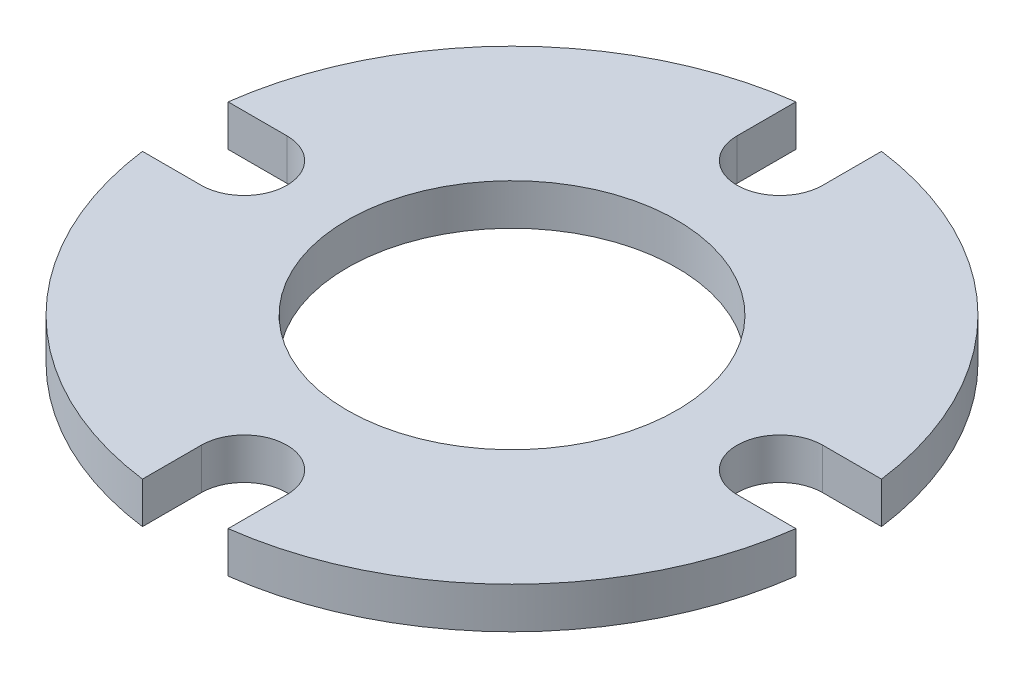
ISO-10303-21;
HEADER;
FILE_DESCRIPTION(('STEP AP214'),'2;1');
FILE_NAME('part.step','',(''),(''),'','','');
FILE_SCHEMA(('AUTOMOTIVE_DESIGN { 1 0 10303 214 1 1 1 1 }'));
ENDSEC;
DATA;
#1=APPLICATION_CONTEXT('core data for automotive mechanical design processes');
#2=APPLICATION_PROTOCOL_DEFINITION('international standard','automotive_design',2000,#1);
#3=PRODUCT_CONTEXT('',#1,'mechanical');
#4=PRODUCT('Part','Part','',(#3));
#5=PRODUCT_RELATED_PRODUCT_CATEGORY('part','',(#4));
#6=PRODUCT_DEFINITION_FORMATION('','',#4);
#7=PRODUCT_DEFINITION_CONTEXT('part definition',#1,'design');
#8=PRODUCT_DEFINITION('design','',#6,#7);
#9=PRODUCT_DEFINITION_SHAPE('','',#8);
#10=(LENGTH_UNIT() NAMED_UNIT(*) SI_UNIT(.MILLI.,.METRE.));
#11=(NAMED_UNIT(*) PLANE_ANGLE_UNIT() SI_UNIT($,.RADIAN.));
#12=(NAMED_UNIT(*) SI_UNIT($,.STERADIAN.) SOLID_ANGLE_UNIT());
#13=UNCERTAINTY_MEASURE_WITH_UNIT(LENGTH_MEASURE(1.E-05),#10,'distance_accuracy_value','');
#14=(GEOMETRIC_REPRESENTATION_CONTEXT(3) GLOBAL_UNCERTAINTY_ASSIGNED_CONTEXT((#13)) GLOBAL_UNIT_ASSIGNED_CONTEXT((#10,
#11,#12)) REPRESENTATION_CONTEXT('',''));
#15=CARTESIAN_POINT('',(0.,0.,0.));
#16=DIRECTION('',(0.,0.,1.));
#17=DIRECTION('',(1.,0.,0.));
#18=AXIS2_PLACEMENT_3D('',#15,#16,#17);
#19=CARTESIAN_POINT('',(0.813,0.125,0.));
#20=DIRECTION('',(0.,1.,0.));
#21=DIRECTION('',(0.,0.,1.));
#22=AXIS2_PLACEMENT_3D('',#19,#20,#21);
#23=PLANE('',#22);
#24=CARTESIAN_POINT('',(0.813,0.125,0.));
#25=DIRECTION('',(0.,-1.,0.));
#26=DIRECTION('',(0.,0.,1.));
#27=AXIS2_PLACEMENT_3D('',#24,#25,#26);
#28=CIRCLE('',#27,0.13);
#29=CARTESIAN_POINT('',(0.813,0.125,0.13));
#30=VERTEX_POINT('',#29);
#31=CARTESIAN_POINT('',(0.813,0.125,-0.13));
#32=VERTEX_POINT('',#31);
#33=EDGE_CURVE('E213',#30,#32,#28,.T.);
#34=ORIENTED_EDGE('',*,*,#33,.T.);
#35=DIRECTION('',(1.,0.,0.));
#36=VECTOR('',#35,1.);
#37=CARTESIAN_POINT('',(0.813,0.125,-0.13));
#38=LINE('',#37,#36);
#39=CARTESIAN_POINT('',(0.991513993849809,0.125,-0.13));
#40=VERTEX_POINT('',#39);
#41=EDGE_CURVE('E121',#32,#40,#38,.T.);
#42=ORIENTED_EDGE('',*,*,#41,.T.);
#43=CARTESIAN_POINT('',(0.,0.125,0.));
#44=DIRECTION('',(0.,1.,0.));
#45=DIRECTION('',(0.,0.,1.));
#46=AXIS2_PLACEMENT_3D('',#43,#44,#45);
#47=CIRCLE('',#46,1.);
#48=CARTESIAN_POINT('',(0.13,0.125,-0.991513993849809));
#49=VERTEX_POINT('',#48);
#50=EDGE_CURVE('E252',#40,#49,#47,.T.);
#51=ORIENTED_EDGE('',*,*,#50,.T.);
#52=DIRECTION('',(0.,0.,1.));
#53=VECTOR('',#52,1.);
#54=CARTESIAN_POINT('',(0.13,0.125,-0.813));
#55=LINE('',#54,#53);
#56=CARTESIAN_POINT('',(0.13,0.125,-0.813));
#57=VERTEX_POINT('',#56);
#58=EDGE_CURVE('E271',#49,#57,#55,.T.);
#59=ORIENTED_EDGE('',*,*,#58,.T.);
#60=CARTESIAN_POINT('',(0.,0.125,-0.813));
#61=DIRECTION('',(0.,-1.,0.));
#62=DIRECTION('',(0.,0.,1.));
#63=AXIS2_PLACEMENT_3D('',#60,#61,#62);
#64=CIRCLE('',#63,0.13);
#65=CARTESIAN_POINT('',(-0.13,0.125,-0.813));
#66=VERTEX_POINT('',#65);
#67=EDGE_CURVE('E268',#57,#66,#64,.T.);
#68=ORIENTED_EDGE('',*,*,#67,.T.);
#69=DIRECTION('',(0.,0.,-1.));
#70=VECTOR('',#69,1.);
#71=CARTESIAN_POINT('',(-0.13,0.125,-0.813));
#72=LINE('',#71,#70);
#73=CARTESIAN_POINT('',(-0.13,0.125,-0.991513993849809));
#74=VERTEX_POINT('',#73);
#75=EDGE_CURVE('E270',#66,#74,#72,.T.);
#76=ORIENTED_EDGE('',*,*,#75,.T.);
#77=CARTESIAN_POINT('',(0.,0.125,0.));
#78=DIRECTION('',(0.,1.,0.));
#79=DIRECTION('',(0.,0.,1.));
#80=AXIS2_PLACEMENT_3D('',#77,#78,#79);
#81=CIRCLE('',#80,1.);
#82=CARTESIAN_POINT('',(-0.991513993849809,0.125,-0.130000000000001));
#83=VERTEX_POINT('',#82);
#84=EDGE_CURVE('E273',#74,#83,#81,.T.);
#85=ORIENTED_EDGE('',*,*,#84,.T.);
#86=DIRECTION('',(1.,0.,0.));
#87=VECTOR('',#86,1.);
#88=CARTESIAN_POINT('',(-0.813,0.125,-0.13));
#89=LINE('',#88,#87);
#90=CARTESIAN_POINT('',(-0.813,0.125,-0.13));
#91=VERTEX_POINT('',#90);
#92=EDGE_CURVE('E279',#83,#91,#89,.T.);
#93=ORIENTED_EDGE('',*,*,#92,.T.);
#94=CARTESIAN_POINT('',(-0.813,0.125,0.));
#95=DIRECTION('',(0.,-1.,0.));
#96=DIRECTION('',(0.,0.,1.));
#97=AXIS2_PLACEMENT_3D('',#94,#95,#96);
#98=CIRCLE('',#97,0.13);
#99=CARTESIAN_POINT('',(-0.813,0.125,0.13));
#100=VERTEX_POINT('',#99);
#101=EDGE_CURVE('E281',#91,#100,#98,.T.);
#102=ORIENTED_EDGE('',*,*,#101,.T.);
#103=DIRECTION('',(-1.,0.,0.));
#104=VECTOR('',#103,1.);
#105=CARTESIAN_POINT('',(-0.813,0.125,0.13));
#106=LINE('',#105,#104);
#107=CARTESIAN_POINT('',(-0.991513993849809,0.125,0.13));
#108=VERTEX_POINT('',#107);
#109=EDGE_CURVE('E283',#100,#108,#106,.T.);
#110=ORIENTED_EDGE('',*,*,#109,.T.);
#111=CARTESIAN_POINT('',(0.,0.125,0.));
#112=DIRECTION('',(0.,1.,0.));
#113=DIRECTION('',(0.,0.,1.));
#114=AXIS2_PLACEMENT_3D('',#111,#112,#113);
#115=CIRCLE('',#114,1.);
#116=CARTESIAN_POINT('',(-0.13,0.125,0.991513993849809));
#117=VERTEX_POINT('',#116);
#118=EDGE_CURVE('E285',#108,#117,#115,.T.);
#119=ORIENTED_EDGE('',*,*,#118,.T.);
#120=DIRECTION('',(0.,0.,-1.));
#121=VECTOR('',#120,1.);
#122=CARTESIAN_POINT('',(-0.13,0.125,0.813));
#123=LINE('',#122,#121);
#124=CARTESIAN_POINT('',(-0.13,0.125,0.813));
#125=VERTEX_POINT('',#124);
#126=EDGE_CURVE('E287',#117,#125,#123,.T.);
#127=ORIENTED_EDGE('',*,*,#126,.T.);
#128=CARTESIAN_POINT('',(0.,0.125,0.813));
#129=DIRECTION('',(0.,-1.,0.));
#130=DIRECTION('',(0.,0.,1.));
#131=AXIS2_PLACEMENT_3D('',#128,#129,#130);
#132=CIRCLE('',#131,0.13);
#133=CARTESIAN_POINT('',(0.13,0.125,0.813));
#134=VERTEX_POINT('',#133);
#135=EDGE_CURVE('E164',#125,#134,#132,.T.);
#136=ORIENTED_EDGE('',*,*,#135,.T.);
#137=DIRECTION('',(0.,0.,1.));
#138=VECTOR('',#137,1.);
#139=CARTESIAN_POINT('',(0.13,0.125,0.813));
#140=LINE('',#139,#138);
#141=CARTESIAN_POINT('',(0.13,0.125,0.991513993849809));
#142=VERTEX_POINT('',#141);
#143=EDGE_CURVE('E158',#134,#142,#140,.T.);
#144=ORIENTED_EDGE('',*,*,#143,.T.);
#145=CARTESIAN_POINT('',(0.,0.125,0.));
#146=DIRECTION('',(0.,1.,0.));
#147=DIRECTION('',(0.,0.,1.));
#148=AXIS2_PLACEMENT_3D('',#145,#146,#147);
#149=CIRCLE('',#148,1.);
#150=CARTESIAN_POINT('',(0.991513993849809,0.125,0.13));
#151=VERTEX_POINT('',#150);
#152=EDGE_CURVE('E162',#142,#151,#149,.T.);
#153=ORIENTED_EDGE('',*,*,#152,.T.);
#154=DIRECTION('',(-1.,0.,0.));
#155=VECTOR('',#154,1.);
#156=CARTESIAN_POINT('',(0.813,0.125,0.13));
#157=LINE('',#156,#155);
#158=EDGE_CURVE('E54',#151,#30,#157,.T.);
#159=ORIENTED_EDGE('',*,*,#158,.T.);
#160=EDGE_LOOP('',(#34,#42,#51,#59,#68,#76,#85,#93,#102,#110,#119,#127,#136,#144,#153,#159));
#161=FACE_BOUND('',#160,.T.);
#162=CARTESIAN_POINT('',(0.,0.125,0.));
#163=DIRECTION('',(0.,1.,0.));
#164=DIRECTION('',(0.,0.,1.));
#165=AXIS2_PLACEMENT_3D('',#162,#163,#164);
#166=CIRCLE('',#165,0.5);
#167=CARTESIAN_POINT('',(0.,0.125,0.5));
#168=VERTEX_POINT('',#167);
#169=EDGE_CURVE('E186',#168,#168,#166,.T.);
#170=ORIENTED_EDGE('',*,*,#169,.F.);
#171=EDGE_LOOP('',(#170));
#172=FACE_BOUND('',#171,.T.);
#173=ADVANCED_FACE('F37',(#161,#172),#23,.T.);
#174=CARTESIAN_POINT('',(0.813,0.,0.));
#175=DIRECTION('',(0.,1.,0.));
#176=DIRECTION('',(0.,0.,1.));
#177=AXIS2_PLACEMENT_3D('',#174,#175,#176);
#178=PLANE('',#177);
#179=CARTESIAN_POINT('',(0.813,0.,0.));
#180=DIRECTION('',(0.,-1.,0.));
#181=DIRECTION('',(0.,0.,1.));
#182=AXIS2_PLACEMENT_3D('',#179,#180,#181);
#183=CIRCLE('',#182,0.13);
#184=CARTESIAN_POINT('',(0.813,0.,0.13));
#185=VERTEX_POINT('',#184);
#186=CARTESIAN_POINT('',(0.813,0.,-0.13));
#187=VERTEX_POINT('',#186);
#188=EDGE_CURVE('E182',#185,#187,#183,.T.);
#189=ORIENTED_EDGE('',*,*,#188,.F.);
#190=DIRECTION('',(-1.,0.,0.));
#191=VECTOR('',#190,1.);
#192=CARTESIAN_POINT('',(0.813,0.,0.13));
#193=LINE('',#192,#191);
#194=CARTESIAN_POINT('',(0.991513993849809,0.,0.13));
#195=VERTEX_POINT('',#194);
#196=EDGE_CURVE('E113',#195,#185,#193,.T.);
#197=ORIENTED_EDGE('',*,*,#196,.F.);
#198=CARTESIAN_POINT('',(0.,0.,0.));
#199=DIRECTION('',(0.,1.,0.));
#200=DIRECTION('',(0.,0.,1.));
#201=AXIS2_PLACEMENT_3D('',#198,#199,#200);
#202=CIRCLE('',#201,1.);
#203=CARTESIAN_POINT('',(0.13,0.,0.991513993849809));
#204=VERTEX_POINT('',#203);
#205=EDGE_CURVE('E107',#204,#195,#202,.T.);
#206=ORIENTED_EDGE('',*,*,#205,.F.);
#207=DIRECTION('',(0.,0.,1.));
#208=VECTOR('',#207,1.);
#209=CARTESIAN_POINT('',(0.13,0.,0.813));
#210=LINE('',#209,#208);
#211=CARTESIAN_POINT('',(0.13,0.,0.813));
#212=VERTEX_POINT('',#211);
#213=EDGE_CURVE('E172',#212,#204,#210,.T.);
#214=ORIENTED_EDGE('',*,*,#213,.F.);
#215=CARTESIAN_POINT('',(0.,0.,0.813));
#216=DIRECTION('',(0.,-1.,0.));
#217=DIRECTION('',(0.,0.,1.));
#218=AXIS2_PLACEMENT_3D('',#215,#216,#217);
#219=CIRCLE('',#218,0.13);
#220=CARTESIAN_POINT('',(-0.13,0.,0.813));
#221=VERTEX_POINT('',#220);
#222=EDGE_CURVE('E208',#221,#212,#219,.T.);
#223=ORIENTED_EDGE('',*,*,#222,.F.);
#224=DIRECTION('',(0.,0.,-1.));
#225=VECTOR('',#224,1.);
#226=CARTESIAN_POINT('',(-0.13,0.,0.813));
#227=LINE('',#226,#225);
#228=CARTESIAN_POINT('',(-0.13,0.,0.991513993849809));
#229=VERTEX_POINT('',#228);
#230=EDGE_CURVE('E206',#229,#221,#227,.T.);
#231=ORIENTED_EDGE('',*,*,#230,.F.);
#232=CARTESIAN_POINT('',(0.,0.,0.));
#233=DIRECTION('',(0.,1.,0.));
#234=DIRECTION('',(0.,0.,1.));
#235=AXIS2_PLACEMENT_3D('',#232,#233,#234);
#236=CIRCLE('',#235,1.);
#237=CARTESIAN_POINT('',(-0.991513993849809,0.,0.13));
#238=VERTEX_POINT('',#237);
#239=EDGE_CURVE('E204',#238,#229,#236,.T.);
#240=ORIENTED_EDGE('',*,*,#239,.F.);
#241=DIRECTION('',(-1.,0.,0.));
#242=VECTOR('',#241,1.);
#243=CARTESIAN_POINT('',(-0.813,0.,0.13));
#244=LINE('',#243,#242);
#245=CARTESIAN_POINT('',(-0.813,0.,0.13));
#246=VERTEX_POINT('',#245);
#247=EDGE_CURVE('E202',#246,#238,#244,.T.);
#248=ORIENTED_EDGE('',*,*,#247,.F.);
#249=CARTESIAN_POINT('',(-0.813,0.,0.));
#250=DIRECTION('',(0.,-1.,0.));
#251=DIRECTION('',(0.,0.,1.));
#252=AXIS2_PLACEMENT_3D('',#249,#250,#251);
#253=CIRCLE('',#252,0.13);
#254=CARTESIAN_POINT('',(-0.813,0.,-0.13));
#255=VERTEX_POINT('',#254);
#256=EDGE_CURVE('E200',#255,#246,#253,.T.);
#257=ORIENTED_EDGE('',*,*,#256,.F.);
#258=DIRECTION('',(1.,0.,0.));
#259=VECTOR('',#258,1.);
#260=CARTESIAN_POINT('',(-0.813,0.,-0.13));
#261=LINE('',#260,#259);
#262=CARTESIAN_POINT('',(-0.991513993849809,0.,-0.130000000000001));
#263=VERTEX_POINT('',#262);
#264=EDGE_CURVE('E198',#263,#255,#261,.T.);
#265=ORIENTED_EDGE('',*,*,#264,.F.);
#266=CARTESIAN_POINT('',(0.,0.,0.));
#267=DIRECTION('',(0.,1.,0.));
#268=DIRECTION('',(0.,0.,1.));
#269=AXIS2_PLACEMENT_3D('',#266,#267,#268);
#270=CIRCLE('',#269,1.);
#271=CARTESIAN_POINT('',(-0.13,0.,-0.991513993849809));
#272=VERTEX_POINT('',#271);
#273=EDGE_CURVE('E196',#272,#263,#270,.T.);
#274=ORIENTED_EDGE('',*,*,#273,.F.);
#275=DIRECTION('',(0.,0.,-1.));
#276=VECTOR('',#275,1.);
#277=CARTESIAN_POINT('',(-0.13,0.,-0.813));
#278=LINE('',#277,#276);
#279=CARTESIAN_POINT('',(-0.13,0.,-0.813));
#280=VERTEX_POINT('',#279);
#281=EDGE_CURVE('E194',#280,#272,#278,.T.);
#282=ORIENTED_EDGE('',*,*,#281,.F.);
#283=CARTESIAN_POINT('',(0.,0.,-0.813));
#284=DIRECTION('',(0.,-1.,0.));
#285=DIRECTION('',(0.,0.,1.));
#286=AXIS2_PLACEMENT_3D('',#283,#284,#285);
#287=CIRCLE('',#286,0.13);
#288=CARTESIAN_POINT('',(0.13,0.,-0.813));
#289=VERTEX_POINT('',#288);
#290=EDGE_CURVE('E192',#289,#280,#287,.T.);
#291=ORIENTED_EDGE('',*,*,#290,.F.);
#292=DIRECTION('',(0.,0.,1.));
#293=VECTOR('',#292,1.);
#294=CARTESIAN_POINT('',(0.13,0.,-0.813));
#295=LINE('',#294,#293);
#296=CARTESIAN_POINT('',(0.13,0.,-0.991513993849809));
#297=VERTEX_POINT('',#296);
#298=EDGE_CURVE('E190',#297,#289,#295,.T.);
#299=ORIENTED_EDGE('',*,*,#298,.F.);
#300=CARTESIAN_POINT('',(0.,0.,0.));
#301=DIRECTION('',(0.,1.,0.));
#302=DIRECTION('',(0.,0.,1.));
#303=AXIS2_PLACEMENT_3D('',#300,#301,#302);
#304=CIRCLE('',#303,1.);
#305=CARTESIAN_POINT('',(0.991513993849809,0.,-0.13));
#306=VERTEX_POINT('',#305);
#307=EDGE_CURVE('E188',#306,#297,#304,.T.);
#308=ORIENTED_EDGE('',*,*,#307,.F.);
#309=DIRECTION('',(1.,0.,0.));
#310=VECTOR('',#309,1.);
#311=CARTESIAN_POINT('',(0.813,0.,-0.13));
#312=LINE('',#311,#310);
#313=EDGE_CURVE('E185',#187,#306,#312,.T.);
#314=ORIENTED_EDGE('',*,*,#313,.F.);
#315=EDGE_LOOP('',(#189,#197,#206,#214,#223,#231,#240,#248,#257,#265,#274,#282,#291,#299,#308,#314));
#316=FACE_BOUND('',#315,.T.);
#317=CARTESIAN_POINT('',(0.,0.,0.));
#318=DIRECTION('',(0.,1.,0.));
#319=DIRECTION('',(0.,0.,1.));
#320=AXIS2_PLACEMENT_3D('',#317,#318,#319);
#321=CIRCLE('',#320,0.5);
#322=CARTESIAN_POINT('',(0.,0.,0.5));
#323=VERTEX_POINT('',#322);
#324=EDGE_CURVE('E524',#323,#323,#321,.T.);
#325=ORIENTED_EDGE('',*,*,#324,.T.);
#326=EDGE_LOOP('',(#325));
#327=FACE_BOUND('',#326,.T.);
#328=ADVANCED_FACE('F256',(#316,#327),#178,.F.);
#329=CARTESIAN_POINT('',(0.813,0.125,0.));
#330=DIRECTION('',(0.,-1.,0.));
#331=DIRECTION('',(0.,0.,-1.));
#332=AXIS2_PLACEMENT_3D('',#329,#330,#331);
#333=CYLINDRICAL_SURFACE('',#332,0.13);
#334=ORIENTED_EDGE('',*,*,#188,.T.);
#335=DIRECTION('',(0.,-1.,0.));
#336=VECTOR('',#335,1.);
#337=CARTESIAN_POINT('',(0.813,0.125,-0.13));
#338=LINE('',#337,#336);
#339=EDGE_CURVE('E11',#32,#187,#338,.T.);
#340=ORIENTED_EDGE('',*,*,#339,.F.);
#341=ORIENTED_EDGE('',*,*,#33,.F.);
#342=DIRECTION('',(0.,-1.,0.));
#343=VECTOR('',#342,1.);
#344=CARTESIAN_POINT('',(0.813,0.125,0.13));
#345=LINE('',#344,#343);
#346=EDGE_CURVE('E178',#30,#185,#345,.T.);
#347=ORIENTED_EDGE('',*,*,#346,.T.);
#348=EDGE_LOOP('',(#334,#340,#341,#347));
#349=FACE_BOUND('',#348,.T.);
#350=ADVANCED_FACE('F39',(#349),#333,.F.);
#351=CARTESIAN_POINT('',(0.813,0.125,-0.13));
#352=DIRECTION('',(0.,0.,-1.));
#353=DIRECTION('',(-1.,0.,0.));
#354=AXIS2_PLACEMENT_3D('',#351,#352,#353);
#355=PLANE('',#354);
#356=ORIENTED_EDGE('',*,*,#313,.T.);
#357=DIRECTION('',(0.,-1.,0.));
#358=VECTOR('',#357,1.);
#359=CARTESIAN_POINT('',(0.991513993849809,0.125,-0.13));
#360=LINE('',#359,#358);
#361=EDGE_CURVE('E46',#40,#306,#360,.T.);
#362=ORIENTED_EDGE('',*,*,#361,.F.);
#363=ORIENTED_EDGE('',*,*,#41,.F.);
#364=ORIENTED_EDGE('',*,*,#339,.T.);
#365=EDGE_LOOP('',(#356,#362,#363,#364));
#366=FACE_BOUND('',#365,.T.);
#367=ADVANCED_FACE('F321',(#366),#355,.F.);
#368=CARTESIAN_POINT('',(0.,0.125,0.));
#369=DIRECTION('',(0.,-1.,0.));
#370=DIRECTION('',(0.,0.,-1.));
#371=AXIS2_PLACEMENT_3D('',#368,#369,#370);
#372=CYLINDRICAL_SURFACE('',#371,1.);
#373=ORIENTED_EDGE('',*,*,#307,.T.);
#374=DIRECTION('',(0.,-1.,0.));
#375=VECTOR('',#374,1.);
#376=CARTESIAN_POINT('',(0.13,0.125,-0.991513993849809));
#377=LINE('',#376,#375);
#378=EDGE_CURVE('E244',#49,#297,#377,.T.);
#379=ORIENTED_EDGE('',*,*,#378,.F.);
#380=ORIENTED_EDGE('',*,*,#50,.F.);
#381=ORIENTED_EDGE('',*,*,#361,.T.);
#382=EDGE_LOOP('',(#373,#379,#380,#381));
#383=FACE_BOUND('',#382,.T.);
#384=ADVANCED_FACE('F250',(#383),#372,.T.);
#385=CARTESIAN_POINT('',(0.13,0.125,-0.813));
#386=DIRECTION('',(1.,0.,0.));
#387=DIRECTION('',(0.,0.,-1.));
#388=AXIS2_PLACEMENT_3D('',#385,#386,#387);
#389=PLANE('',#388);
#390=ORIENTED_EDGE('',*,*,#298,.T.);
#391=DIRECTION('',(0.,-1.,0.));
#392=VECTOR('',#391,1.);
#393=CARTESIAN_POINT('',(0.13,0.125,-0.813));
#394=LINE('',#393,#392);
#395=EDGE_CURVE('E241',#57,#289,#394,.T.);
#396=ORIENTED_EDGE('',*,*,#395,.F.);
#397=ORIENTED_EDGE('',*,*,#58,.F.);
#398=ORIENTED_EDGE('',*,*,#378,.T.);
#399=EDGE_LOOP('',(#390,#396,#397,#398));
#400=FACE_BOUND('',#399,.T.);
#401=ADVANCED_FACE('F262',(#400),#389,.F.);
#402=CARTESIAN_POINT('',(0.,0.125,-0.813));
#403=DIRECTION('',(0.,-1.,0.));
#404=DIRECTION('',(0.,0.,-1.));
#405=AXIS2_PLACEMENT_3D('',#402,#403,#404);
#406=CYLINDRICAL_SURFACE('',#405,0.13);
#407=ORIENTED_EDGE('',*,*,#290,.T.);
#408=DIRECTION('',(0.,-1.,0.));
#409=VECTOR('',#408,1.);
#410=CARTESIAN_POINT('',(-0.13,0.125,-0.813));
#411=LINE('',#410,#409);
#412=EDGE_CURVE('E238',#66,#280,#411,.T.);
#413=ORIENTED_EDGE('',*,*,#412,.F.);
#414=ORIENTED_EDGE('',*,*,#67,.F.);
#415=ORIENTED_EDGE('',*,*,#395,.T.);
#416=EDGE_LOOP('',(#407,#413,#414,#415));
#417=FACE_BOUND('',#416,.T.);
#418=ADVANCED_FACE('F266',(#417),#406,.F.);
#419=CARTESIAN_POINT('',(-0.13,0.125,-0.813));
#420=DIRECTION('',(-1.,0.,0.));
#421=DIRECTION('',(0.,0.,1.));
#422=AXIS2_PLACEMENT_3D('',#419,#420,#421);
#423=PLANE('',#422);
#424=ORIENTED_EDGE('',*,*,#281,.T.);
#425=DIRECTION('',(0.,-1.,0.));
#426=VECTOR('',#425,1.);
#427=CARTESIAN_POINT('',(-0.13,0.125,-0.991513993849809));
#428=LINE('',#427,#426);
#429=EDGE_CURVE('E235',#74,#272,#428,.T.);
#430=ORIENTED_EDGE('',*,*,#429,.F.);
#431=ORIENTED_EDGE('',*,*,#75,.F.);
#432=ORIENTED_EDGE('',*,*,#412,.T.);
#433=EDGE_LOOP('',(#424,#430,#431,#432));
#434=FACE_BOUND('',#433,.T.);
#435=ADVANCED_FACE('F334',(#434),#423,.F.);
#436=CARTESIAN_POINT('',(0.,0.125,0.));
#437=DIRECTION('',(0.,-1.,0.));
#438=DIRECTION('',(0.,0.,-1.));
#439=AXIS2_PLACEMENT_3D('',#436,#437,#438);
#440=CYLINDRICAL_SURFACE('',#439,1.);
#441=ORIENTED_EDGE('',*,*,#273,.T.);
#442=DIRECTION('',(0.,-1.,0.));
#443=VECTOR('',#442,1.);
#444=CARTESIAN_POINT('',(-0.991513993849809,0.125,-0.130000000000001));
#445=LINE('',#444,#443);
#446=EDGE_CURVE('E232',#83,#263,#445,.T.);
#447=ORIENTED_EDGE('',*,*,#446,.F.);
#448=ORIENTED_EDGE('',*,*,#84,.F.);
#449=ORIENTED_EDGE('',*,*,#429,.T.);
#450=EDGE_LOOP('',(#441,#447,#448,#449));
#451=FACE_BOUND('',#450,.T.);
#452=ADVANCED_FACE('F337',(#451),#440,.T.);
#453=CARTESIAN_POINT('',(-0.813,0.125,-0.13));
#454=DIRECTION('',(0.,0.,-1.));
#455=DIRECTION('',(-1.,0.,0.));
#456=AXIS2_PLACEMENT_3D('',#453,#454,#455);
#457=PLANE('',#456);
#458=ORIENTED_EDGE('',*,*,#264,.T.);
#459=DIRECTION('',(0.,-1.,0.));
#460=VECTOR('',#459,1.);
#461=CARTESIAN_POINT('',(-0.813,0.125,-0.13));
#462=LINE('',#461,#460);
#463=EDGE_CURVE('E229',#91,#255,#462,.T.);
#464=ORIENTED_EDGE('',*,*,#463,.F.);
#465=ORIENTED_EDGE('',*,*,#92,.F.);
#466=ORIENTED_EDGE('',*,*,#446,.T.);
#467=EDGE_LOOP('',(#458,#464,#465,#466));
#468=FACE_BOUND('',#467,.T.);
#469=ADVANCED_FACE('F341',(#468),#457,.F.);
#470=CARTESIAN_POINT('',(-0.813,0.125,0.));
#471=DIRECTION('',(0.,-1.,0.));
#472=DIRECTION('',(0.,0.,-1.));
#473=AXIS2_PLACEMENT_3D('',#470,#471,#472);
#474=CYLINDRICAL_SURFACE('',#473,0.13);
#475=ORIENTED_EDGE('',*,*,#256,.T.);
#476=DIRECTION('',(0.,-1.,0.));
#477=VECTOR('',#476,1.);
#478=CARTESIAN_POINT('',(-0.813,0.125,0.13));
#479=LINE('',#478,#477);
#480=EDGE_CURVE('E226',#100,#246,#479,.T.);
#481=ORIENTED_EDGE('',*,*,#480,.F.);
#482=ORIENTED_EDGE('',*,*,#101,.F.);
#483=ORIENTED_EDGE('',*,*,#463,.T.);
#484=EDGE_LOOP('',(#475,#481,#482,#483));
#485=FACE_BOUND('',#484,.T.);
#486=ADVANCED_FACE('F345',(#485),#474,.F.);
#487=CARTESIAN_POINT('',(-0.813,0.125,0.13));
#488=DIRECTION('',(0.,0.,1.));
#489=DIRECTION('',(1.,0.,0.));
#490=AXIS2_PLACEMENT_3D('',#487,#488,#489);
#491=PLANE('',#490);
#492=ORIENTED_EDGE('',*,*,#247,.T.);
#493=DIRECTION('',(0.,-1.,0.));
#494=VECTOR('',#493,1.);
#495=CARTESIAN_POINT('',(-0.991513993849809,0.125,0.13));
#496=LINE('',#495,#494);
#497=EDGE_CURVE('E223',#108,#238,#496,.T.);
#498=ORIENTED_EDGE('',*,*,#497,.F.);
#499=ORIENTED_EDGE('',*,*,#109,.F.);
#500=ORIENTED_EDGE('',*,*,#480,.T.);
#501=EDGE_LOOP('',(#492,#498,#499,#500));
#502=FACE_BOUND('',#501,.T.);
#503=ADVANCED_FACE('F349',(#502),#491,.F.);
#504=CARTESIAN_POINT('',(0.,0.125,0.));
#505=DIRECTION('',(0.,-1.,0.));
#506=DIRECTION('',(0.,0.,-1.));
#507=AXIS2_PLACEMENT_3D('',#504,#505,#506);
#508=CYLINDRICAL_SURFACE('',#507,1.);
#509=ORIENTED_EDGE('',*,*,#239,.T.);
#510=DIRECTION('',(0.,-1.,0.));
#511=VECTOR('',#510,1.);
#512=CARTESIAN_POINT('',(-0.13,0.125,0.991513993849809));
#513=LINE('',#512,#511);
#514=EDGE_CURVE('E220',#117,#229,#513,.T.);
#515=ORIENTED_EDGE('',*,*,#514,.F.);
#516=ORIENTED_EDGE('',*,*,#118,.F.);
#517=ORIENTED_EDGE('',*,*,#497,.T.);
#518=EDGE_LOOP('',(#509,#515,#516,#517));
#519=FACE_BOUND('',#518,.T.);
#520=ADVANCED_FACE('F353',(#519),#508,.T.);
#521=CARTESIAN_POINT('',(-0.13,0.125,0.813));
#522=DIRECTION('',(-1.,0.,0.));
#523=DIRECTION('',(0.,0.,1.));
#524=AXIS2_PLACEMENT_3D('',#521,#522,#523);
#525=PLANE('',#524);
#526=ORIENTED_EDGE('',*,*,#230,.T.);
#527=DIRECTION('',(0.,-1.,0.));
#528=VECTOR('',#527,1.);
#529=CARTESIAN_POINT('',(-0.13,0.125,0.813));
#530=LINE('',#529,#528);
#531=EDGE_CURVE('E217',#125,#221,#530,.T.);
#532=ORIENTED_EDGE('',*,*,#531,.F.);
#533=ORIENTED_EDGE('',*,*,#126,.F.);
#534=ORIENTED_EDGE('',*,*,#514,.T.);
#535=EDGE_LOOP('',(#526,#532,#533,#534));
#536=FACE_BOUND('',#535,.T.);
#537=ADVANCED_FACE('F293',(#536),#525,.F.);
#538=CARTESIAN_POINT('',(0.,0.125,0.813));
#539=DIRECTION('',(0.,-1.,0.));
#540=DIRECTION('',(0.,0.,-1.));
#541=AXIS2_PLACEMENT_3D('',#538,#539,#540);
#542=CYLINDRICAL_SURFACE('',#541,0.13);
#543=ORIENTED_EDGE('',*,*,#222,.T.);
#544=DIRECTION('',(0.,-1.,0.));
#545=VECTOR('',#544,1.);
#546=CARTESIAN_POINT('',(0.13,0.125,0.813));
#547=LINE('',#546,#545);
#548=EDGE_CURVE('E173',#134,#212,#547,.T.);
#549=ORIENTED_EDGE('',*,*,#548,.F.);
#550=ORIENTED_EDGE('',*,*,#135,.F.);
#551=ORIENTED_EDGE('',*,*,#531,.T.);
#552=EDGE_LOOP('',(#543,#549,#550,#551));
#553=FACE_BOUND('',#552,.T.);
#554=ADVANCED_FACE('F297',(#553),#542,.F.);
#555=CARTESIAN_POINT('',(0.13,0.125,0.813));
#556=DIRECTION('',(1.,0.,0.));
#557=DIRECTION('',(0.,0.,-1.));
#558=AXIS2_PLACEMENT_3D('',#555,#556,#557);
#559=PLANE('',#558);
#560=ORIENTED_EDGE('',*,*,#213,.T.);
#561=DIRECTION('',(0.,-1.,0.));
#562=VECTOR('',#561,1.);
#563=CARTESIAN_POINT('',(0.13,0.125,0.991513993849809));
#564=LINE('',#563,#562);
#565=EDGE_CURVE('E169',#142,#204,#564,.T.);
#566=ORIENTED_EDGE('',*,*,#565,.F.);
#567=ORIENTED_EDGE('',*,*,#143,.F.);
#568=ORIENTED_EDGE('',*,*,#548,.T.);
#569=EDGE_LOOP('',(#560,#566,#567,#568));
#570=FACE_BOUND('',#569,.T.);
#571=ADVANCED_FACE('F170',(#570),#559,.F.);
#572=CARTESIAN_POINT('',(0.,0.125,0.));
#573=DIRECTION('',(0.,-1.,0.));
#574=DIRECTION('',(0.,0.,-1.));
#575=AXIS2_PLACEMENT_3D('',#572,#573,#574);
#576=CYLINDRICAL_SURFACE('',#575,1.);
#577=ORIENTED_EDGE('',*,*,#205,.T.);
#578=DIRECTION('',(0.,-1.,0.));
#579=VECTOR('',#578,1.);
#580=CARTESIAN_POINT('',(0.991513993849809,0.125,0.13));
#581=LINE('',#580,#579);
#582=EDGE_CURVE('E174',#151,#195,#581,.T.);
#583=ORIENTED_EDGE('',*,*,#582,.F.);
#584=ORIENTED_EDGE('',*,*,#152,.F.);
#585=ORIENTED_EDGE('',*,*,#565,.T.);
#586=EDGE_LOOP('',(#577,#583,#584,#585));
#587=FACE_BOUND('',#586,.T.);
#588=ADVANCED_FACE('F176',(#587),#576,.T.);
#589=CARTESIAN_POINT('',(0.813,0.125,0.13));
#590=DIRECTION('',(0.,0.,1.));
#591=DIRECTION('',(1.,0.,0.));
#592=AXIS2_PLACEMENT_3D('',#589,#590,#591);
#593=PLANE('',#592);
#594=ORIENTED_EDGE('',*,*,#196,.T.);
#595=ORIENTED_EDGE('',*,*,#346,.F.);
#596=ORIENTED_EDGE('',*,*,#158,.F.);
#597=ORIENTED_EDGE('',*,*,#582,.T.);
#598=EDGE_LOOP('',(#594,#595,#596,#597));
#599=FACE_BOUND('',#598,.T.);
#600=ADVANCED_FACE('F301',(#599),#593,.F.);
#601=CARTESIAN_POINT('',(0.,0.125,0.));
#602=DIRECTION('',(0.,-1.,0.));
#603=DIRECTION('',(0.,0.,-1.));
#604=AXIS2_PLACEMENT_3D('',#601,#602,#603);
#605=CYLINDRICAL_SURFACE('',#604,0.5);
#606=ORIENTED_EDGE('',*,*,#169,.T.);
#607=EDGE_LOOP('',(#606));
#608=FACE_BOUND('',#607,.T.);
#609=ORIENTED_EDGE('',*,*,#324,.F.);
#610=EDGE_LOOP('',(#609));
#611=FACE_BOUND('',#610,.T.);
#612=ADVANCED_FACE('F303',(#608,#611),#605,.F.);
#613=CLOSED_SHELL('',(#173,#328,#350,#367,#384,#401,#418,#435,#452,#469,#486,#503,#520,#537,
#554,#571,#588,#600,#612));
#614=MANIFOLD_SOLID_BREP('B2',#613);
#615=ADVANCED_BREP_SHAPE_REPRESENTATION('',(#18,#614),#14);
#616=SHAPE_DEFINITION_REPRESENTATION(#9,#615);
ENDSEC;
END-ISO-10303-21;
